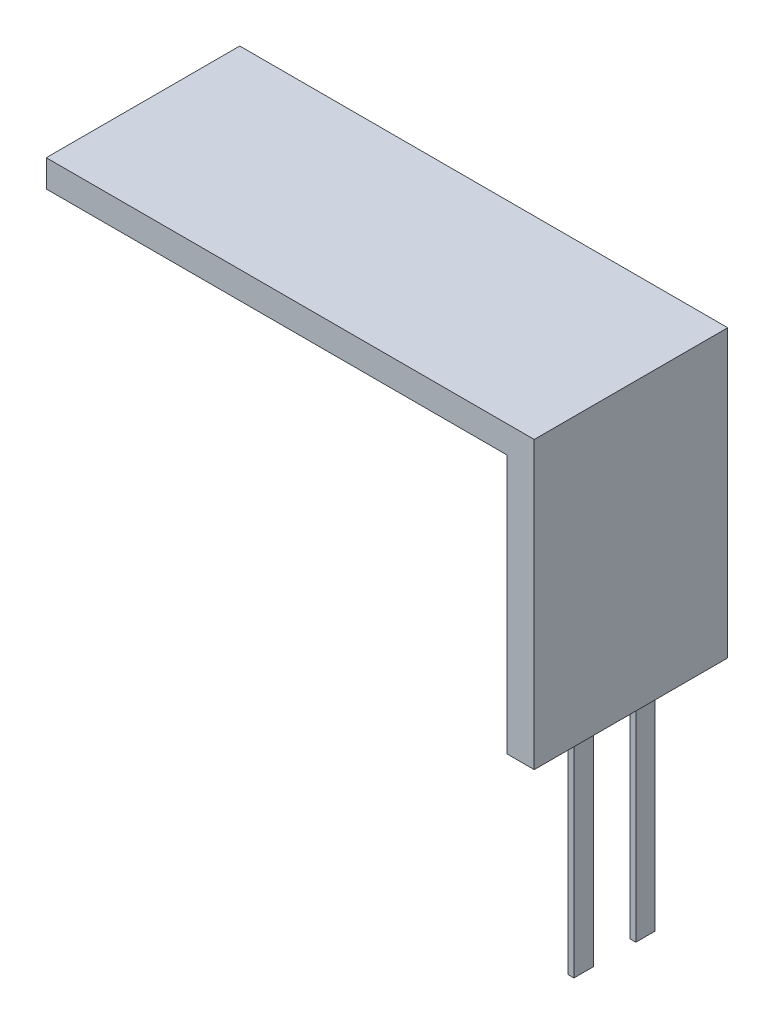
ISO-10303-21;
HEADER;
FILE_DESCRIPTION(('STEP AP214'),'2;1');
FILE_NAME('part.step','',(''),(''),'','','');
FILE_SCHEMA(('AUTOMOTIVE_DESIGN { 1 0 10303 214 1 1 1 1 }'));
ENDSEC;
DATA;
#1=APPLICATION_CONTEXT('core data for automotive mechanical design processes');
#2=APPLICATION_PROTOCOL_DEFINITION('international standard','automotive_design',2000,#1);
#3=PRODUCT_CONTEXT('',#1,'mechanical');
#4=PRODUCT('Part','Part','',(#3));
#5=PRODUCT_RELATED_PRODUCT_CATEGORY('part','',(#4));
#6=PRODUCT_DEFINITION_FORMATION('','',#4);
#7=PRODUCT_DEFINITION_CONTEXT('part definition',#1,'design');
#8=PRODUCT_DEFINITION('design','',#6,#7);
#9=PRODUCT_DEFINITION_SHAPE('','',#8);
#10=(LENGTH_UNIT() NAMED_UNIT(*) SI_UNIT(.MILLI.,.METRE.));
#11=(NAMED_UNIT(*) PLANE_ANGLE_UNIT() SI_UNIT($,.RADIAN.));
#12=(NAMED_UNIT(*) SI_UNIT($,.STERADIAN.) SOLID_ANGLE_UNIT());
#13=UNCERTAINTY_MEASURE_WITH_UNIT(LENGTH_MEASURE(1.E-05),#10,'distance_accuracy_value','');
#14=(GEOMETRIC_REPRESENTATION_CONTEXT(3) GLOBAL_UNCERTAINTY_ASSIGNED_CONTEXT((#13)) GLOBAL_UNIT_ASSIGNED_CONTEXT((#10,
#11,#12)) REPRESENTATION_CONTEXT('',''));
#15=CARTESIAN_POINT('',(0.,0.,0.));
#16=DIRECTION('',(0.,0.,1.));
#17=DIRECTION('',(1.,0.,0.));
#18=AXIS2_PLACEMENT_3D('',#15,#16,#17);
#19=CARTESIAN_POINT('',(0.,5.6,0.));
#20=DIRECTION('',(0.,1.,0.));
#21=DIRECTION('',(0.,0.,1.));
#22=AXIS2_PLACEMENT_3D('',#19,#20,#21);
#23=PLANE('',#22);
#24=DIRECTION('',(-1.,0.,0.));
#25=VECTOR('',#24,1.);
#26=CARTESIAN_POINT('',(-0.075,5.6,-1.05));
#27=LINE('',#26,#25);
#28=CARTESIAN_POINT('',(0.075,5.6,-1.05));
#29=VERTEX_POINT('',#28);
#30=CARTESIAN_POINT('',(-0.075,5.6,-1.05));
#31=VERTEX_POINT('',#30);
#32=EDGE_CURVE('E237',#29,#31,#27,.T.);
#33=ORIENTED_EDGE('',*,*,#32,.T.);
#34=DIRECTION('',(0.,0.,1.));
#35=VECTOR('',#34,1.);
#36=CARTESIAN_POINT('',(-0.075,5.6,-1.05));
#37=LINE('',#36,#35);
#38=CARTESIAN_POINT('',(-0.075,5.6,-0.55));
#39=VERTEX_POINT('',#38);
#40=EDGE_CURVE('E213',#31,#39,#37,.T.);
#41=ORIENTED_EDGE('',*,*,#40,.T.);
#42=DIRECTION('',(1.,0.,0.));
#43=VECTOR('',#42,1.);
#44=CARTESIAN_POINT('',(-0.075,5.6,-0.55));
#45=LINE('',#44,#43);
#46=CARTESIAN_POINT('',(0.075,5.6,-0.55));
#47=VERTEX_POINT('',#46);
#48=EDGE_CURVE('E209',#39,#47,#45,.T.);
#49=ORIENTED_EDGE('',*,*,#48,.T.);
#50=DIRECTION('',(0.,0.,-1.));
#51=VECTOR('',#50,1.);
#52=CARTESIAN_POINT('',(0.075,5.6,-1.05));
#53=LINE('',#52,#51);
#54=EDGE_CURVE('E210',#47,#29,#53,.T.);
#55=ORIENTED_EDGE('',*,*,#54,.T.);
#56=EDGE_LOOP('',(#33,#41,#49,#55));
#57=FACE_BOUND('',#56,.T.);
#58=DIRECTION('',(0.,0.,1.));
#59=VECTOR('',#58,1.);
#60=CARTESIAN_POINT('',(-0.2,5.6,-2.5));
#61=LINE('',#60,#59);
#62=CARTESIAN_POINT('',(-0.2,5.6,-2.5));
#63=VERTEX_POINT('',#62);
#64=CARTESIAN_POINT('',(-0.2,5.6,2.5));
#65=VERTEX_POINT('',#64);
#66=EDGE_CURVE('E190',#63,#65,#61,.T.);
#67=ORIENTED_EDGE('',*,*,#66,.F.);
#68=DIRECTION('',(-1.,0.,0.));
#69=VECTOR('',#68,1.);
#70=CARTESIAN_POINT('',(-0.2,5.6,-2.5));
#71=LINE('',#70,#69);
#72=CARTESIAN_POINT('',(0.5,5.6,-2.5));
#73=VERTEX_POINT('',#72);
#74=EDGE_CURVE('E147',#73,#63,#71,.T.);
#75=ORIENTED_EDGE('',*,*,#74,.F.);
#76=DIRECTION('',(0.,0.,-1.));
#77=VECTOR('',#76,1.);
#78=CARTESIAN_POINT('',(0.5,5.6,-2.5));
#79=LINE('',#78,#77);
#80=CARTESIAN_POINT('',(0.5,5.6,2.5));
#81=VERTEX_POINT('',#80);
#82=EDGE_CURVE('E198',#81,#73,#79,.T.);
#83=ORIENTED_EDGE('',*,*,#82,.F.);
#84=DIRECTION('',(1.,0.,0.));
#85=VECTOR('',#84,1.);
#86=CARTESIAN_POINT('',(-0.2,5.6,2.5));
#87=LINE('',#86,#85);
#88=EDGE_CURVE('E192',#65,#81,#87,.T.);
#89=ORIENTED_EDGE('',*,*,#88,.F.);
#90=EDGE_LOOP('',(#67,#75,#83,#89));
#91=FACE_BOUND('',#90,.T.);
#92=DIRECTION('',(0.,0.,-1.));
#93=VECTOR('',#92,1.);
#94=CARTESIAN_POINT('',(-0.075,5.6,0.));
#95=LINE('',#94,#93);
#96=CARTESIAN_POINT('',(-0.075,5.6,1.05));
#97=VERTEX_POINT('',#96);
#98=CARTESIAN_POINT('',(-0.075,5.6,0.55));
#99=VERTEX_POINT('',#98);
#100=EDGE_CURVE('E11',#97,#99,#95,.T.);
#101=ORIENTED_EDGE('',*,*,#100,.F.);
#102=DIRECTION('',(-1.,0.,0.));
#103=VECTOR('',#102,1.);
#104=CARTESIAN_POINT('',(0.,5.6,1.05));
#105=LINE('',#104,#103);
#106=CARTESIAN_POINT('',(0.075,5.6,1.05));
#107=VERTEX_POINT('',#106);
#108=EDGE_CURVE('E50',#107,#97,#105,.T.);
#109=ORIENTED_EDGE('',*,*,#108,.F.);
#110=DIRECTION('',(0.,0.,1.));
#111=VECTOR('',#110,1.);
#112=CARTESIAN_POINT('',(0.075,5.6,0.));
#113=LINE('',#112,#111);
#114=CARTESIAN_POINT('',(0.075,5.6,0.55));
#115=VERTEX_POINT('',#114);
#116=EDGE_CURVE('E245',#115,#107,#113,.T.);
#117=ORIENTED_EDGE('',*,*,#116,.F.);
#118=DIRECTION('',(1.,0.,0.));
#119=VECTOR('',#118,1.);
#120=CARTESIAN_POINT('',(0.,5.6,0.55));
#121=LINE('',#120,#119);
#122=EDGE_CURVE('E239',#99,#115,#121,.T.);
#123=ORIENTED_EDGE('',*,*,#122,.F.);
#124=EDGE_LOOP('',(#101,#109,#117,#123));
#125=FACE_BOUND('',#124,.T.);
#126=ADVANCED_FACE('F39',(#57,#91,#125),#23,.F.);
#127=CARTESIAN_POINT('',(-0.075,6.1,-1.05));
#128=DIRECTION('',(1.,0.,0.));
#129=DIRECTION('',(0.,0.,-1.));
#130=AXIS2_PLACEMENT_3D('',#127,#128,#129);
#131=PLANE('',#130);
#132=ORIENTED_EDGE('',*,*,#40,.F.);
#133=DIRECTION('',(0.,-1.,0.));
#134=VECTOR('',#133,1.);
#135=CARTESIAN_POINT('',(-0.075,6.1,-1.05));
#136=LINE('',#135,#134);
#137=CARTESIAN_POINT('',(-0.075,0.,-1.05));
#138=VERTEX_POINT('',#137);
#139=EDGE_CURVE('E227',#31,#138,#136,.T.);
#140=ORIENTED_EDGE('',*,*,#139,.T.);
#141=DIRECTION('',(0.,0.,1.));
#142=VECTOR('',#141,1.);
#143=CARTESIAN_POINT('',(-0.075,0.,-1.05));
#144=LINE('',#143,#142);
#145=CARTESIAN_POINT('',(-0.075,0.,-0.55));
#146=VERTEX_POINT('',#145);
#147=EDGE_CURVE('E216',#138,#146,#144,.T.);
#148=ORIENTED_EDGE('',*,*,#147,.T.);
#149=DIRECTION('',(0.,-1.,0.));
#150=VECTOR('',#149,1.);
#151=CARTESIAN_POINT('',(-0.075,6.1,-0.55));
#152=LINE('',#151,#150);
#153=EDGE_CURVE('E232',#39,#146,#152,.T.);
#154=ORIENTED_EDGE('',*,*,#153,.F.);
#155=EDGE_LOOP('',(#132,#140,#148,#154));
#156=FACE_BOUND('',#155,.T.);
#157=ADVANCED_FACE('F41',(#156),#131,.F.);
#158=CARTESIAN_POINT('',(-0.075,6.1,-0.55));
#159=DIRECTION('',(0.,0.,-1.));
#160=DIRECTION('',(-1.,0.,0.));
#161=AXIS2_PLACEMENT_3D('',#158,#159,#160);
#162=PLANE('',#161);
#163=ORIENTED_EDGE('',*,*,#48,.F.);
#164=ORIENTED_EDGE('',*,*,#153,.T.);
#165=DIRECTION('',(1.,0.,0.));
#166=VECTOR('',#165,1.);
#167=CARTESIAN_POINT('',(-0.075,0.,-0.55));
#168=LINE('',#167,#166);
#169=CARTESIAN_POINT('',(0.075,0.,-0.55));
#170=VERTEX_POINT('',#169);
#171=EDGE_CURVE('E218',#146,#170,#168,.T.);
#172=ORIENTED_EDGE('',*,*,#171,.T.);
#173=DIRECTION('',(0.,-1.,0.));
#174=VECTOR('',#173,1.);
#175=CARTESIAN_POINT('',(0.075,6.1,-0.55));
#176=LINE('',#175,#174);
#177=EDGE_CURVE('E235',#47,#170,#176,.T.);
#178=ORIENTED_EDGE('',*,*,#177,.F.);
#179=EDGE_LOOP('',(#163,#164,#172,#178));
#180=FACE_BOUND('',#179,.T.);
#181=ADVANCED_FACE('F280',(#180),#162,.F.);
#182=CARTESIAN_POINT('',(0.075,6.1,-1.05));
#183=DIRECTION('',(-1.,0.,0.));
#184=DIRECTION('',(0.,0.,1.));
#185=AXIS2_PLACEMENT_3D('',#182,#183,#184);
#186=PLANE('',#185);
#187=ORIENTED_EDGE('',*,*,#54,.F.);
#188=ORIENTED_EDGE('',*,*,#177,.T.);
#189=DIRECTION('',(0.,0.,-1.));
#190=VECTOR('',#189,1.);
#191=CARTESIAN_POINT('',(0.075,0.,-1.05));
#192=LINE('',#191,#190);
#193=CARTESIAN_POINT('',(0.075,0.,-1.05));
#194=VERTEX_POINT('',#193);
#195=EDGE_CURVE('E225',#170,#194,#192,.T.);
#196=ORIENTED_EDGE('',*,*,#195,.T.);
#197=DIRECTION('',(0.,-1.,0.));
#198=VECTOR('',#197,1.);
#199=CARTESIAN_POINT('',(0.075,6.1,-1.05));
#200=LINE('',#199,#198);
#201=EDGE_CURVE('E229',#29,#194,#200,.T.);
#202=ORIENTED_EDGE('',*,*,#201,.F.);
#203=EDGE_LOOP('',(#187,#188,#196,#202));
#204=FACE_BOUND('',#203,.T.);
#205=ADVANCED_FACE('F305',(#204),#186,.F.);
#206=CARTESIAN_POINT('',(-0.075,6.1,-1.05));
#207=DIRECTION('',(0.,0.,1.));
#208=DIRECTION('',(1.,0.,0.));
#209=AXIS2_PLACEMENT_3D('',#206,#207,#208);
#210=PLANE('',#209);
#211=ORIENTED_EDGE('',*,*,#32,.F.);
#212=ORIENTED_EDGE('',*,*,#201,.T.);
#213=DIRECTION('',(-1.,0.,0.));
#214=VECTOR('',#213,1.);
#215=CARTESIAN_POINT('',(-0.075,0.,-1.05));
#216=LINE('',#215,#214);
#217=EDGE_CURVE('E223',#194,#138,#216,.T.);
#218=ORIENTED_EDGE('',*,*,#217,.T.);
#219=ORIENTED_EDGE('',*,*,#139,.F.);
#220=EDGE_LOOP('',(#211,#212,#218,#219));
#221=FACE_BOUND('',#220,.T.);
#222=ADVANCED_FACE('F297',(#221),#210,.F.);
#223=CARTESIAN_POINT('',(0.,0.,0.));
#224=DIRECTION('',(0.,1.,0.));
#225=DIRECTION('',(0.,0.,1.));
#226=AXIS2_PLACEMENT_3D('',#223,#224,#225);
#227=PLANE('',#226);
#228=ORIENTED_EDGE('',*,*,#147,.F.);
#229=ORIENTED_EDGE('',*,*,#217,.F.);
#230=ORIENTED_EDGE('',*,*,#195,.F.);
#231=ORIENTED_EDGE('',*,*,#171,.F.);
#232=EDGE_LOOP('',(#228,#229,#230,#231));
#233=FACE_BOUND('',#232,.T.);
#234=ADVANCED_FACE('F293',(#233),#227,.F.);
#235=CARTESIAN_POINT('',(-0.2,12.99,-2.5));
#236=DIRECTION('',(1.,0.,0.));
#237=DIRECTION('',(0.,0.,-1.));
#238=AXIS2_PLACEMENT_3D('',#235,#236,#237);
#239=PLANE('',#238);
#240=DIRECTION('',(0.,-1.,0.));
#241=VECTOR('',#240,1.);
#242=CARTESIAN_POINT('',(-0.2,12.99,2.5));
#243=LINE('',#242,#241);
#244=CARTESIAN_POINT('',(-0.2,12.29,2.5));
#245=VERTEX_POINT('',#244);
#246=EDGE_CURVE('E202',#245,#65,#243,.T.);
#247=ORIENTED_EDGE('',*,*,#246,.F.);
#248=DIRECTION('',(0.,0.,-1.));
#249=VECTOR('',#248,1.);
#250=CARTESIAN_POINT('',(-0.2,12.29,-2.5));
#251=LINE('',#250,#249);
#252=CARTESIAN_POINT('',(-0.2,12.29,-2.5));
#253=VERTEX_POINT('',#252);
#254=EDGE_CURVE('E423',#245,#253,#251,.T.);
#255=ORIENTED_EDGE('',*,*,#254,.T.);
#256=DIRECTION('',(0.,-1.,0.));
#257=VECTOR('',#256,1.);
#258=CARTESIAN_POINT('',(-0.2,12.99,-2.5));
#259=LINE('',#258,#257);
#260=EDGE_CURVE('E191',#253,#63,#259,.T.);
#261=ORIENTED_EDGE('',*,*,#260,.T.);
#262=ORIENTED_EDGE('',*,*,#66,.T.);
#263=EDGE_LOOP('',(#247,#255,#261,#262));
#264=FACE_BOUND('',#263,.T.);
#265=ADVANCED_FACE('F295',(#264),#239,.F.);
#266=CARTESIAN_POINT('',(-0.2,12.99,2.5));
#267=DIRECTION('',(0.,0.,-1.));
#268=DIRECTION('',(-1.,0.,0.));
#269=AXIS2_PLACEMENT_3D('',#266,#267,#268);
#270=PLANE('',#269);
#271=ORIENTED_EDGE('',*,*,#88,.T.);
#272=DIRECTION('',(0.,-1.,0.));
#273=VECTOR('',#272,1.);
#274=CARTESIAN_POINT('',(0.5,12.99,2.5));
#275=LINE('',#274,#273);
#276=CARTESIAN_POINT('',(0.5,12.99,2.5));
#277=VERTEX_POINT('',#276);
#278=EDGE_CURVE('E148',#277,#81,#275,.T.);
#279=ORIENTED_EDGE('',*,*,#278,.F.);
#280=DIRECTION('',(1.,0.,0.));
#281=VECTOR('',#280,1.);
#282=CARTESIAN_POINT('',(-0.2,12.99,2.5));
#283=LINE('',#282,#281);
#284=CARTESIAN_POINT('',(-12.11,12.99,2.5));
#285=VERTEX_POINT('',#284);
#286=EDGE_CURVE('E137',#285,#277,#283,.T.);
#287=ORIENTED_EDGE('',*,*,#286,.F.);
#288=DIRECTION('',(0.,-1.,0.));
#289=VECTOR('',#288,1.);
#290=CARTESIAN_POINT('',(-12.11,12.99,2.5));
#291=LINE('',#290,#289);
#292=CARTESIAN_POINT('',(-12.11,12.29,2.5));
#293=VERTEX_POINT('',#292);
#294=EDGE_CURVE('E141',#285,#293,#291,.T.);
#295=ORIENTED_EDGE('',*,*,#294,.T.);
#296=DIRECTION('',(1.,0.,0.));
#297=VECTOR('',#296,1.);
#298=CARTESIAN_POINT('',(-12.11,12.29,2.5));
#299=LINE('',#298,#297);
#300=EDGE_CURVE('E420',#293,#245,#299,.T.);
#301=ORIENTED_EDGE('',*,*,#300,.T.);
#302=ORIENTED_EDGE('',*,*,#246,.T.);
#303=EDGE_LOOP('',(#271,#279,#287,#295,#301,#302));
#304=FACE_BOUND('',#303,.T.);
#305=ADVANCED_FACE('F143',(#304),#270,.F.);
#306=CARTESIAN_POINT('',(0.5,12.99,-2.5));
#307=DIRECTION('',(-1.,0.,0.));
#308=DIRECTION('',(0.,0.,1.));
#309=AXIS2_PLACEMENT_3D('',#306,#307,#308);
#310=PLANE('',#309);
#311=ORIENTED_EDGE('',*,*,#82,.T.);
#312=DIRECTION('',(0.,-1.,0.));
#313=VECTOR('',#312,1.);
#314=CARTESIAN_POINT('',(0.5,12.99,-2.5));
#315=LINE('',#314,#313);
#316=CARTESIAN_POINT('',(0.5,12.99,-2.5));
#317=VERTEX_POINT('',#316);
#318=EDGE_CURVE('E203',#317,#73,#315,.T.);
#319=ORIENTED_EDGE('',*,*,#318,.F.);
#320=DIRECTION('',(0.,0.,-1.));
#321=VECTOR('',#320,1.);
#322=CARTESIAN_POINT('',(0.5,12.99,-2.5));
#323=LINE('',#322,#321);
#324=EDGE_CURVE('E149',#277,#317,#323,.T.);
#325=ORIENTED_EDGE('',*,*,#324,.F.);
#326=ORIENTED_EDGE('',*,*,#278,.T.);
#327=EDGE_LOOP('',(#311,#319,#325,#326));
#328=FACE_BOUND('',#327,.T.);
#329=ADVANCED_FACE('F284',(#328),#310,.F.);
#330=CARTESIAN_POINT('',(-0.2,12.99,-2.5));
#331=DIRECTION('',(0.,0.,1.));
#332=DIRECTION('',(1.,0.,0.));
#333=AXIS2_PLACEMENT_3D('',#330,#331,#332);
#334=PLANE('',#333);
#335=ORIENTED_EDGE('',*,*,#74,.T.);
#336=ORIENTED_EDGE('',*,*,#260,.F.);
#337=DIRECTION('',(-1.,0.,0.));
#338=VECTOR('',#337,1.);
#339=CARTESIAN_POINT('',(-12.11,12.29,-2.5));
#340=LINE('',#339,#338);
#341=CARTESIAN_POINT('',(-12.11,12.29,-2.5));
#342=VERTEX_POINT('',#341);
#343=EDGE_CURVE('E53',#253,#342,#340,.T.);
#344=ORIENTED_EDGE('',*,*,#343,.T.);
#345=DIRECTION('',(0.,-1.,0.));
#346=VECTOR('',#345,1.);
#347=CARTESIAN_POINT('',(-12.11,12.99,-2.5));
#348=LINE('',#347,#346);
#349=CARTESIAN_POINT('',(-12.11,12.99,-2.5));
#350=VERTEX_POINT('',#349);
#351=EDGE_CURVE('E159',#350,#342,#348,.T.);
#352=ORIENTED_EDGE('',*,*,#351,.F.);
#353=DIRECTION('',(-1.,0.,0.));
#354=VECTOR('',#353,1.);
#355=CARTESIAN_POINT('',(-0.2,12.99,-2.5));
#356=LINE('',#355,#354);
#357=EDGE_CURVE('E156',#317,#350,#356,.T.);
#358=ORIENTED_EDGE('',*,*,#357,.F.);
#359=ORIENTED_EDGE('',*,*,#318,.T.);
#360=EDGE_LOOP('',(#335,#336,#344,#352,#358,#359));
#361=FACE_BOUND('',#360,.T.);
#362=ADVANCED_FACE('F285',(#361),#334,.F.);
#363=CARTESIAN_POINT('',(0.,12.99,0.));
#364=DIRECTION('',(0.,1.,0.));
#365=DIRECTION('',(0.,0.,1.));
#366=AXIS2_PLACEMENT_3D('',#363,#364,#365);
#367=PLANE('',#366);
#368=ORIENTED_EDGE('',*,*,#357,.T.);
#369=DIRECTION('',(0.,0.,1.));
#370=VECTOR('',#369,1.);
#371=CARTESIAN_POINT('',(-12.11,12.99,-2.5));
#372=LINE('',#371,#370);
#373=EDGE_CURVE('E153',#350,#285,#372,.T.);
#374=ORIENTED_EDGE('',*,*,#373,.T.);
#375=ORIENTED_EDGE('',*,*,#286,.T.);
#376=ORIENTED_EDGE('',*,*,#324,.T.);
#377=EDGE_LOOP('',(#368,#374,#375,#376));
#378=FACE_BOUND('',#377,.T.);
#379=ADVANCED_FACE('F152',(#378),#367,.T.);
#380=CARTESIAN_POINT('',(-0.075,6.1,0.55));
#381=DIRECTION('',(1.,0.,0.));
#382=DIRECTION('',(0.,0.,-1.));
#383=AXIS2_PLACEMENT_3D('',#380,#381,#382);
#384=PLANE('',#383);
#385=DIRECTION('',(0.,-1.,0.));
#386=VECTOR('',#385,1.);
#387=CARTESIAN_POINT('',(-0.075,6.1,1.05));
#388=LINE('',#387,#386);
#389=CARTESIAN_POINT('',(-0.075,0.,1.05));
#390=VERTEX_POINT('',#389);
#391=EDGE_CURVE('E163',#97,#390,#388,.T.);
#392=ORIENTED_EDGE('',*,*,#391,.F.);
#393=ORIENTED_EDGE('',*,*,#100,.T.);
#394=DIRECTION('',(0.,-1.,0.));
#395=VECTOR('',#394,1.);
#396=CARTESIAN_POINT('',(-0.075,6.1,0.55));
#397=LINE('',#396,#395);
#398=CARTESIAN_POINT('',(-0.075,0.,0.55));
#399=VERTEX_POINT('',#398);
#400=EDGE_CURVE('E173',#99,#399,#397,.T.);
#401=ORIENTED_EDGE('',*,*,#400,.T.);
#402=DIRECTION('',(0.,0.,1.));
#403=VECTOR('',#402,1.);
#404=CARTESIAN_POINT('',(-0.075,0.,0.55));
#405=LINE('',#404,#403);
#406=EDGE_CURVE('E183',#399,#390,#405,.T.);
#407=ORIENTED_EDGE('',*,*,#406,.T.);
#408=EDGE_LOOP('',(#392,#393,#401,#407));
#409=FACE_BOUND('',#408,.T.);
#410=ADVANCED_FACE('F249',(#409),#384,.F.);
#411=CARTESIAN_POINT('',(-0.075,6.1,1.05));
#412=DIRECTION('',(0.,0.,-1.));
#413=DIRECTION('',(-1.,0.,0.));
#414=AXIS2_PLACEMENT_3D('',#411,#412,#413);
#415=PLANE('',#414);
#416=DIRECTION('',(0.,-1.,0.));
#417=VECTOR('',#416,1.);
#418=CARTESIAN_POINT('',(0.075,6.1,1.05));
#419=LINE('',#418,#417);
#420=CARTESIAN_POINT('',(0.075,0.,1.05));
#421=VERTEX_POINT('',#420);
#422=EDGE_CURVE('E167',#107,#421,#419,.T.);
#423=ORIENTED_EDGE('',*,*,#422,.F.);
#424=ORIENTED_EDGE('',*,*,#108,.T.);
#425=ORIENTED_EDGE('',*,*,#391,.T.);
#426=DIRECTION('',(1.,0.,0.));
#427=VECTOR('',#426,1.);
#428=CARTESIAN_POINT('',(-0.075,0.,1.05));
#429=LINE('',#428,#427);
#430=EDGE_CURVE('E185',#390,#421,#429,.T.);
#431=ORIENTED_EDGE('',*,*,#430,.T.);
#432=EDGE_LOOP('',(#423,#424,#425,#431));
#433=FACE_BOUND('',#432,.T.);
#434=ADVANCED_FACE('F250',(#433),#415,.F.);
#435=CARTESIAN_POINT('',(0.075,6.1,0.55));
#436=DIRECTION('',(-1.,0.,0.));
#437=DIRECTION('',(0.,0.,1.));
#438=AXIS2_PLACEMENT_3D('',#435,#436,#437);
#439=PLANE('',#438);
#440=DIRECTION('',(0.,-1.,0.));
#441=VECTOR('',#440,1.);
#442=CARTESIAN_POINT('',(0.075,6.1,0.55));
#443=LINE('',#442,#441);
#444=CARTESIAN_POINT('',(0.075,0.,0.55));
#445=VERTEX_POINT('',#444);
#446=EDGE_CURVE('E175',#115,#445,#443,.T.);
#447=ORIENTED_EDGE('',*,*,#446,.F.);
#448=ORIENTED_EDGE('',*,*,#116,.T.);
#449=ORIENTED_EDGE('',*,*,#422,.T.);
#450=DIRECTION('',(0.,0.,-1.));
#451=VECTOR('',#450,1.);
#452=CARTESIAN_POINT('',(0.075,0.,0.55));
#453=LINE('',#452,#451);
#454=EDGE_CURVE('E177',#421,#445,#453,.T.);
#455=ORIENTED_EDGE('',*,*,#454,.T.);
#456=EDGE_LOOP('',(#447,#448,#449,#455));
#457=FACE_BOUND('',#456,.T.);
#458=ADVANCED_FACE('F259',(#457),#439,.F.);
#459=CARTESIAN_POINT('',(-0.075,6.1,0.55));
#460=DIRECTION('',(0.,0.,1.));
#461=DIRECTION('',(1.,0.,0.));
#462=AXIS2_PLACEMENT_3D('',#459,#460,#461);
#463=PLANE('',#462);
#464=ORIENTED_EDGE('',*,*,#400,.F.);
#465=ORIENTED_EDGE('',*,*,#122,.T.);
#466=ORIENTED_EDGE('',*,*,#446,.T.);
#467=DIRECTION('',(-1.,0.,0.));
#468=VECTOR('',#467,1.);
#469=CARTESIAN_POINT('',(-0.075,0.,0.55));
#470=LINE('',#469,#468);
#471=EDGE_CURVE('E176',#445,#399,#470,.T.);
#472=ORIENTED_EDGE('',*,*,#471,.T.);
#473=EDGE_LOOP('',(#464,#465,#466,#472));
#474=FACE_BOUND('',#473,.T.);
#475=ADVANCED_FACE('F261',(#474),#463,.F.);
#476=CARTESIAN_POINT('',(0.,0.,0.));
#477=DIRECTION('',(0.,1.,0.));
#478=DIRECTION('',(0.,0.,1.));
#479=AXIS2_PLACEMENT_3D('',#476,#477,#478);
#480=PLANE('',#479);
#481=ORIENTED_EDGE('',*,*,#406,.F.);
#482=ORIENTED_EDGE('',*,*,#471,.F.);
#483=ORIENTED_EDGE('',*,*,#454,.F.);
#484=ORIENTED_EDGE('',*,*,#430,.F.);
#485=EDGE_LOOP('',(#481,#482,#483,#484));
#486=FACE_BOUND('',#485,.T.);
#487=ADVANCED_FACE('F254',(#486),#480,.F.);
#488=CARTESIAN_POINT('',(-12.11,12.99,-2.5));
#489=DIRECTION('',(1.,0.,0.));
#490=DIRECTION('',(0.,0.,-1.));
#491=AXIS2_PLACEMENT_3D('',#488,#489,#490);
#492=PLANE('',#491);
#493=DIRECTION('',(0.,0.,1.));
#494=VECTOR('',#493,1.);
#495=CARTESIAN_POINT('',(-12.11,12.29,-2.5));
#496=LINE('',#495,#494);
#497=EDGE_CURVE('E162',#342,#293,#496,.T.);
#498=ORIENTED_EDGE('',*,*,#497,.T.);
#499=ORIENTED_EDGE('',*,*,#294,.F.);
#500=ORIENTED_EDGE('',*,*,#373,.F.);
#501=ORIENTED_EDGE('',*,*,#351,.T.);
#502=EDGE_LOOP('',(#498,#499,#500,#501));
#503=FACE_BOUND('',#502,.T.);
#504=ADVANCED_FACE('F165',(#503),#492,.F.);
#505=CARTESIAN_POINT('',(0.,12.29,0.));
#506=DIRECTION('',(0.,1.,0.));
#507=DIRECTION('',(0.,0.,1.));
#508=AXIS2_PLACEMENT_3D('',#505,#506,#507);
#509=PLANE('',#508);
#510=ORIENTED_EDGE('',*,*,#497,.F.);
#511=ORIENTED_EDGE('',*,*,#343,.F.);
#512=ORIENTED_EDGE('',*,*,#254,.F.);
#513=ORIENTED_EDGE('',*,*,#300,.F.);
#514=EDGE_LOOP('',(#510,#511,#512,#513));
#515=FACE_BOUND('',#514,.T.);
#516=ADVANCED_FACE('F407',(#515),#509,.F.);
#517=CLOSED_SHELL('',(#126,#157,#181,#205,#222,#234,#265,#305,#329,#362,#379,#410,#434,#458,
#475,#487,#504,#516));
#518=MANIFOLD_SOLID_BREP('B2',#517);
#519=ADVANCED_BREP_SHAPE_REPRESENTATION('',(#18,#518),#14);
#520=SHAPE_DEFINITION_REPRESENTATION(#9,#519);
ENDSEC;
END-ISO-10303-21;
